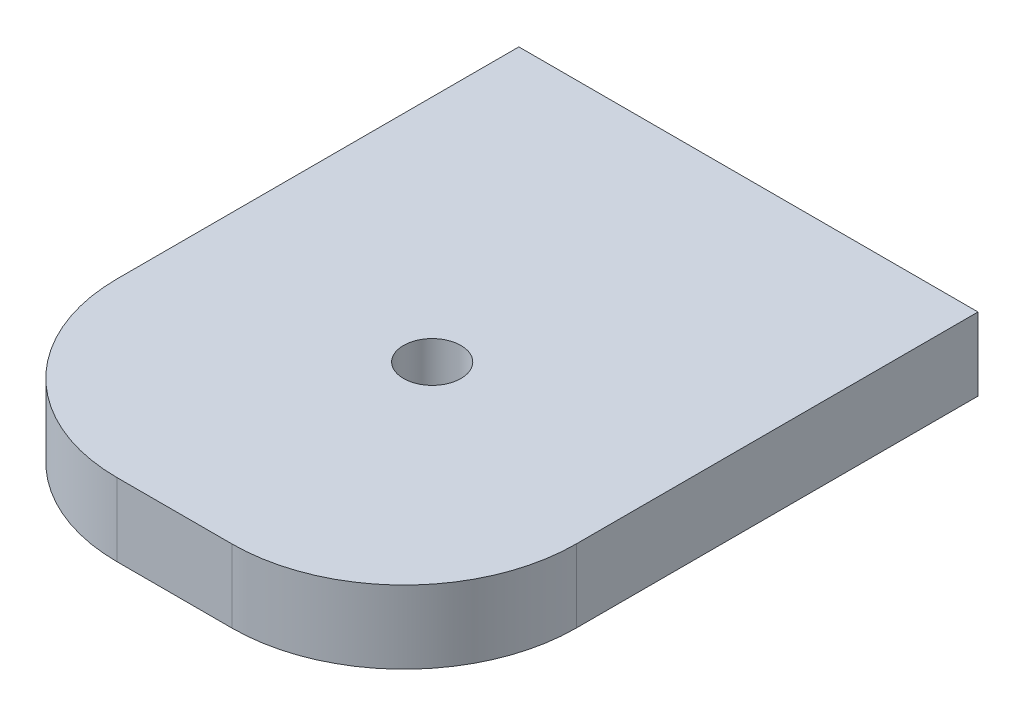
ISO-10303-21;
HEADER;
FILE_DESCRIPTION(('STEP AP214'),'2;1');
FILE_NAME('part.step','',(''),(''),'','','');
FILE_SCHEMA(('AUTOMOTIVE_DESIGN { 1 0 10303 214 1 1 1 1 }'));
ENDSEC;
DATA;
#1=APPLICATION_CONTEXT('core data for automotive mechanical design processes');
#2=APPLICATION_PROTOCOL_DEFINITION('international standard','automotive_design',2000,#1);
#3=PRODUCT_CONTEXT('',#1,'mechanical');
#4=PRODUCT('Part','Part','',(#3));
#5=PRODUCT_RELATED_PRODUCT_CATEGORY('part','',(#4));
#6=PRODUCT_DEFINITION_FORMATION('','',#4);
#7=PRODUCT_DEFINITION_CONTEXT('part definition',#1,'design');
#8=PRODUCT_DEFINITION('design','',#6,#7);
#9=PRODUCT_DEFINITION_SHAPE('','',#8);
#10=(LENGTH_UNIT() NAMED_UNIT(*) SI_UNIT(.MILLI.,.METRE.));
#11=(NAMED_UNIT(*) PLANE_ANGLE_UNIT() SI_UNIT($,.RADIAN.));
#12=(NAMED_UNIT(*) SI_UNIT($,.STERADIAN.) SOLID_ANGLE_UNIT());
#13=UNCERTAINTY_MEASURE_WITH_UNIT(LENGTH_MEASURE(1.E-05),#10,'distance_accuracy_value','');
#14=(GEOMETRIC_REPRESENTATION_CONTEXT(3) GLOBAL_UNCERTAINTY_ASSIGNED_CONTEXT((#13)) GLOBAL_UNIT_ASSIGNED_CONTEXT((#10,
#11,#12)) REPRESENTATION_CONTEXT('',''));
#15=CARTESIAN_POINT('',(0.,0.,0.));
#16=DIRECTION('',(0.,0.,1.));
#17=DIRECTION('',(1.,0.,0.));
#18=AXIS2_PLACEMENT_3D('',#15,#16,#17);
#19=CARTESIAN_POINT('',(0.,6.35,0.));
#20=DIRECTION('',(0.,1.,0.));
#21=DIRECTION('',(0.,0.,1.));
#22=AXIS2_PLACEMENT_3D('',#19,#20,#21);
#23=PLANE('',#22);
#24=DIRECTION('',(1.,0.,0.));
#25=VECTOR('',#24,1.);
#26=CARTESIAN_POINT('',(-18.6770428015564,6.35,24.7859922178988));
#27=LINE('',#26,#25);
#28=CARTESIAN_POINT('',(-3.67704280155642,6.35,24.7859922178988));
#29=VERTEX_POINT('',#28);
#30=CARTESIAN_POINT('',(6.32295719844358,6.35,24.7859922178988));
#31=VERTEX_POINT('',#30);
#32=EDGE_CURVE('E97',#29,#31,#27,.T.);
#33=ORIENTED_EDGE('',*,*,#32,.T.);
#34=CARTESIAN_POINT('',(6.32295719844358,6.35,9.78599221789885));
#35=DIRECTION('',(0.,1.,0.));
#36=DIRECTION('',(0.,0.,1.));
#37=AXIS2_PLACEMENT_3D('',#34,#35,#36);
#38=CIRCLE('',#37,15.);
#39=CARTESIAN_POINT('',(21.3229571984436,6.35,9.78599221789885));
#40=VERTEX_POINT('',#39);
#41=EDGE_CURVE('E41',#31,#40,#38,.T.);
#42=ORIENTED_EDGE('',*,*,#41,.T.);
#43=DIRECTION('',(0.,0.,-1.));
#44=VECTOR('',#43,1.);
#45=CARTESIAN_POINT('',(21.3229571984436,6.35,-25.2140077821012));
#46=LINE('',#45,#44);
#47=CARTESIAN_POINT('',(21.3229571984436,6.35,-25.2140077821012));
#48=VERTEX_POINT('',#47);
#49=EDGE_CURVE('E87',#40,#48,#46,.T.);
#50=ORIENTED_EDGE('',*,*,#49,.T.);
#51=DIRECTION('',(-1.,0.,0.));
#52=VECTOR('',#51,1.);
#53=CARTESIAN_POINT('',(-18.6770428015564,6.35,-25.2140077821012));
#54=LINE('',#53,#52);
#55=CARTESIAN_POINT('',(-18.6770428015564,6.35,-25.2140077821012));
#56=VERTEX_POINT('',#55);
#57=EDGE_CURVE('E91',#48,#56,#54,.T.);
#58=ORIENTED_EDGE('',*,*,#57,.T.);
#59=DIRECTION('',(0.,0.,1.));
#60=VECTOR('',#59,1.);
#61=CARTESIAN_POINT('',(-18.6770428015564,6.35,-25.2140077821012));
#62=LINE('',#61,#60);
#63=CARTESIAN_POINT('',(-18.6770428015564,6.35,9.78599221789885));
#64=VERTEX_POINT('',#63);
#65=EDGE_CURVE('E122',#56,#64,#62,.T.);
#66=ORIENTED_EDGE('',*,*,#65,.T.);
#67=CARTESIAN_POINT('',(-3.67704280155642,6.35,9.78599221789885));
#68=DIRECTION('',(0.,1.,0.));
#69=DIRECTION('',(0.,0.,1.));
#70=AXIS2_PLACEMENT_3D('',#67,#68,#69);
#71=CIRCLE('',#70,15.);
#72=EDGE_CURVE('E133',#64,#29,#71,.T.);
#73=ORIENTED_EDGE('',*,*,#72,.T.);
#74=EDGE_LOOP('',(#33,#42,#50,#58,#66,#73));
#75=FACE_BOUND('',#74,.T.);
#76=CARTESIAN_POINT('',(1.32295719844358,6.35,2.33463035019456));
#77=DIRECTION('',(0.,1.,0.));
#78=DIRECTION('',(0.,0.,1.));
#79=AXIS2_PLACEMENT_3D('',#76,#77,#78);
#80=CIRCLE('',#79,2.5);
#81=CARTESIAN_POINT('',(1.32295719844358,6.35,4.83463035019456));
#82=VERTEX_POINT('',#81);
#83=EDGE_CURVE('E118',#82,#82,#80,.T.);
#84=ORIENTED_EDGE('',*,*,#83,.F.);
#85=EDGE_LOOP('',(#84));
#86=FACE_BOUND('',#85,.T.);
#87=ADVANCED_FACE('F33',(#75,#86),#23,.T.);
#88=CARTESIAN_POINT('',(0.,0.,0.));
#89=DIRECTION('',(0.,1.,0.));
#90=DIRECTION('',(0.,0.,1.));
#91=AXIS2_PLACEMENT_3D('',#88,#89,#90);
#92=PLANE('',#91);
#93=DIRECTION('',(0.,0.,-1.));
#94=VECTOR('',#93,1.);
#95=CARTESIAN_POINT('',(21.3229571984436,0.,-25.2140077821012));
#96=LINE('',#95,#94);
#97=CARTESIAN_POINT('',(21.3229571984436,0.,9.78599221789885));
#98=VERTEX_POINT('',#97);
#99=CARTESIAN_POINT('',(21.3229571984436,0.,-25.2140077821012));
#100=VERTEX_POINT('',#99);
#101=EDGE_CURVE('E103',#98,#100,#96,.T.);
#102=ORIENTED_EDGE('',*,*,#101,.F.);
#103=CARTESIAN_POINT('',(6.32295719844358,0.,9.78599221789885));
#104=DIRECTION('',(0.,1.,0.));
#105=DIRECTION('',(0.,0.,1.));
#106=AXIS2_PLACEMENT_3D('',#103,#104,#105);
#107=CIRCLE('',#106,15.);
#108=CARTESIAN_POINT('',(6.32295719844358,0.,24.7859922178988));
#109=VERTEX_POINT('',#108);
#110=EDGE_CURVE('E127',#98,#109,#107,.F.);
#111=ORIENTED_EDGE('',*,*,#110,.T.);
#112=DIRECTION('',(1.,0.,0.));
#113=VECTOR('',#112,1.);
#114=CARTESIAN_POINT('',(-18.6770428015564,0.,24.7859922178988));
#115=LINE('',#114,#113);
#116=CARTESIAN_POINT('',(-3.67704280155642,0.,24.7859922178988));
#117=VERTEX_POINT('',#116);
#118=EDGE_CURVE('E117',#117,#109,#115,.T.);
#119=ORIENTED_EDGE('',*,*,#118,.F.);
#120=CARTESIAN_POINT('',(-3.67704280155642,0.,9.78599221789885));
#121=DIRECTION('',(0.,1.,0.));
#122=DIRECTION('',(0.,0.,1.));
#123=AXIS2_PLACEMENT_3D('',#120,#121,#122);
#124=CIRCLE('',#123,15.);
#125=CARTESIAN_POINT('',(-18.6770428015564,0.,9.78599221789885));
#126=VERTEX_POINT('',#125);
#127=EDGE_CURVE('E125',#117,#126,#124,.F.);
#128=ORIENTED_EDGE('',*,*,#127,.T.);
#129=DIRECTION('',(0.,0.,1.));
#130=VECTOR('',#129,1.);
#131=CARTESIAN_POINT('',(-18.6770428015564,0.,-25.2140077821012));
#132=LINE('',#131,#130);
#133=CARTESIAN_POINT('',(-18.6770428015564,0.,-25.2140077821012));
#134=VERTEX_POINT('',#133);
#135=EDGE_CURVE('E115',#134,#126,#132,.T.);
#136=ORIENTED_EDGE('',*,*,#135,.F.);
#137=DIRECTION('',(-1.,0.,0.));
#138=VECTOR('',#137,1.);
#139=CARTESIAN_POINT('',(-18.6770428015564,0.,-25.2140077821012));
#140=LINE('',#139,#138);
#141=EDGE_CURVE('E121',#100,#134,#140,.T.);
#142=ORIENTED_EDGE('',*,*,#141,.F.);
#143=EDGE_LOOP('',(#102,#111,#119,#128,#136,#142));
#144=FACE_BOUND('',#143,.T.);
#145=CARTESIAN_POINT('',(1.32295719844358,0.,2.33463035019456));
#146=DIRECTION('',(0.,1.,0.));
#147=DIRECTION('',(0.,0.,1.));
#148=AXIS2_PLACEMENT_3D('',#145,#146,#147);
#149=CIRCLE('',#148,2.5);
#150=CARTESIAN_POINT('',(1.32295719844358,0.,4.83463035019456));
#151=VERTEX_POINT('',#150);
#152=EDGE_CURVE('E146',#151,#151,#149,.T.);
#153=ORIENTED_EDGE('',*,*,#152,.T.);
#154=EDGE_LOOP('',(#153));
#155=FACE_BOUND('',#154,.T.);
#156=ADVANCED_FACE('F141',(#144,#155),#92,.F.);
#157=CARTESIAN_POINT('',(-18.6770428015564,6.35,-25.2140077821012));
#158=DIRECTION('',(1.,0.,0.));
#159=DIRECTION('',(0.,0.,-1.));
#160=AXIS2_PLACEMENT_3D('',#157,#158,#159);
#161=PLANE('',#160);
#162=ORIENTED_EDGE('',*,*,#135,.T.);
#163=DIRECTION('',(0.,-1.,0.));
#164=VECTOR('',#163,1.);
#165=CARTESIAN_POINT('',(-18.6770428015564,6.35,9.78599221789885));
#166=LINE('',#165,#164);
#167=EDGE_CURVE('E11',#126,#64,#166,.F.);
#168=ORIENTED_EDGE('',*,*,#167,.T.);
#169=ORIENTED_EDGE('',*,*,#65,.F.);
#170=DIRECTION('',(0.,-1.,0.));
#171=VECTOR('',#170,1.);
#172=CARTESIAN_POINT('',(-18.6770428015564,6.35,-25.2140077821012));
#173=LINE('',#172,#171);
#174=EDGE_CURVE('E107',#56,#134,#173,.T.);
#175=ORIENTED_EDGE('',*,*,#174,.T.);
#176=EDGE_LOOP('',(#162,#168,#169,#175));
#177=FACE_BOUND('',#176,.T.);
#178=ADVANCED_FACE('F143',(#177),#161,.F.);
#179=CARTESIAN_POINT('',(-18.6770428015564,6.35,24.7859922178988));
#180=DIRECTION('',(0.,0.,-1.));
#181=DIRECTION('',(-1.,0.,0.));
#182=AXIS2_PLACEMENT_3D('',#179,#180,#181);
#183=PLANE('',#182);
#184=ORIENTED_EDGE('',*,*,#118,.T.);
#185=DIRECTION('',(0.,-1.,0.));
#186=VECTOR('',#185,1.);
#187=CARTESIAN_POINT('',(6.32295719844358,6.35,24.7859922178988));
#188=LINE('',#187,#186);
#189=EDGE_CURVE('E54',#109,#31,#188,.F.);
#190=ORIENTED_EDGE('',*,*,#189,.T.);
#191=ORIENTED_EDGE('',*,*,#32,.F.);
#192=DIRECTION('',(0.,-1.,0.));
#193=VECTOR('',#192,1.);
#194=CARTESIAN_POINT('',(-3.67704280155642,6.35,24.7859922178988));
#195=LINE('',#194,#193);
#196=EDGE_CURVE('E129',#29,#117,#195,.T.);
#197=ORIENTED_EDGE('',*,*,#196,.T.);
#198=EDGE_LOOP('',(#184,#190,#191,#197));
#199=FACE_BOUND('',#198,.T.);
#200=ADVANCED_FACE('F137',(#199),#183,.F.);
#201=CARTESIAN_POINT('',(21.3229571984436,6.35,-25.2140077821012));
#202=DIRECTION('',(-1.,0.,0.));
#203=DIRECTION('',(0.,0.,1.));
#204=AXIS2_PLACEMENT_3D('',#201,#202,#203);
#205=PLANE('',#204);
#206=ORIENTED_EDGE('',*,*,#49,.F.);
#207=DIRECTION('',(0.,-1.,0.));
#208=VECTOR('',#207,1.);
#209=CARTESIAN_POINT('',(21.3229571984436,6.35,9.78599221789885));
#210=LINE('',#209,#208);
#211=EDGE_CURVE('E106',#40,#98,#210,.T.);
#212=ORIENTED_EDGE('',*,*,#211,.T.);
#213=ORIENTED_EDGE('',*,*,#101,.T.);
#214=DIRECTION('',(0.,-1.,0.));
#215=VECTOR('',#214,1.);
#216=CARTESIAN_POINT('',(21.3229571984436,6.35,-25.2140077821012));
#217=LINE('',#216,#215);
#218=EDGE_CURVE('E100',#48,#100,#217,.T.);
#219=ORIENTED_EDGE('',*,*,#218,.F.);
#220=EDGE_LOOP('',(#206,#212,#213,#219));
#221=FACE_BOUND('',#220,.T.);
#222=ADVANCED_FACE('F101',(#221),#205,.F.);
#223=CARTESIAN_POINT('',(-18.6770428015564,6.35,-25.2140077821012));
#224=DIRECTION('',(0.,0.,1.));
#225=DIRECTION('',(1.,0.,0.));
#226=AXIS2_PLACEMENT_3D('',#223,#224,#225);
#227=PLANE('',#226);
#228=ORIENTED_EDGE('',*,*,#141,.T.);
#229=ORIENTED_EDGE('',*,*,#174,.F.);
#230=ORIENTED_EDGE('',*,*,#57,.F.);
#231=ORIENTED_EDGE('',*,*,#218,.T.);
#232=EDGE_LOOP('',(#228,#229,#230,#231));
#233=FACE_BOUND('',#232,.T.);
#234=ADVANCED_FACE('F109',(#233),#227,.F.);
#235=CARTESIAN_POINT('',(1.32295719844358,6.35,2.33463035019456));
#236=DIRECTION('',(0.,-1.,0.));
#237=DIRECTION('',(0.,0.,-1.));
#238=AXIS2_PLACEMENT_3D('',#235,#236,#237);
#239=CYLINDRICAL_SURFACE('',#238,2.5);
#240=ORIENTED_EDGE('',*,*,#83,.T.);
#241=EDGE_LOOP('',(#240));
#242=FACE_BOUND('',#241,.T.);
#243=ORIENTED_EDGE('',*,*,#152,.F.);
#244=EDGE_LOOP('',(#243));
#245=FACE_BOUND('',#244,.T.);
#246=ADVANCED_FACE('F152',(#242,#245),#239,.F.);
#247=CARTESIAN_POINT('',(6.32295719844358,6.35,9.78599221789885));
#248=DIRECTION('',(0.,-1.,0.));
#249=DIRECTION('',(0.,0.,-1.));
#250=AXIS2_PLACEMENT_3D('',#247,#248,#249);
#251=CYLINDRICAL_SURFACE('',#250,15.);
#252=ORIENTED_EDGE('',*,*,#41,.F.);
#253=ORIENTED_EDGE('',*,*,#189,.F.);
#254=ORIENTED_EDGE('',*,*,#110,.F.);
#255=ORIENTED_EDGE('',*,*,#211,.F.);
#256=EDGE_LOOP('',(#252,#253,#254,#255));
#257=FACE_BOUND('',#256,.T.);
#258=ADVANCED_FACE('F169',(#257),#251,.T.);
#259=CARTESIAN_POINT('',(-3.67704280155642,6.35,9.78599221789885));
#260=DIRECTION('',(0.,-1.,0.));
#261=DIRECTION('',(0.,0.,-1.));
#262=AXIS2_PLACEMENT_3D('',#259,#260,#261);
#263=CYLINDRICAL_SURFACE('',#262,15.);
#264=ORIENTED_EDGE('',*,*,#72,.F.);
#265=ORIENTED_EDGE('',*,*,#167,.F.);
#266=ORIENTED_EDGE('',*,*,#127,.F.);
#267=ORIENTED_EDGE('',*,*,#196,.F.);
#268=EDGE_LOOP('',(#264,#265,#266,#267));
#269=FACE_BOUND('',#268,.T.);
#270=ADVANCED_FACE('F35',(#269),#263,.T.);
#271=CLOSED_SHELL('',(#87,#156,#178,#200,#222,#234,#246,#258,#270));
#272=MANIFOLD_SOLID_BREP('B2',#271);
#273=ADVANCED_BREP_SHAPE_REPRESENTATION('',(#18,#272),#14);
#274=SHAPE_DEFINITION_REPRESENTATION(#9,#273);
ENDSEC;
END-ISO-10303-21;
